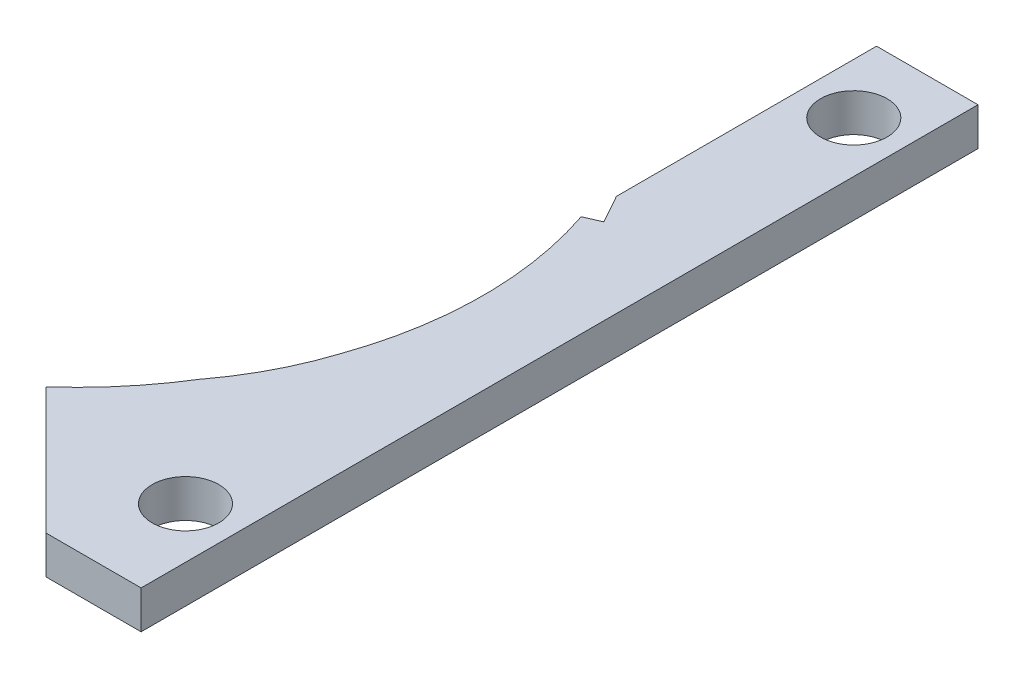
ISO-10303-21;
HEADER;
FILE_DESCRIPTION(('STEP AP214'),'2;1');
FILE_NAME('part.step','',(''),(''),'','','');
FILE_SCHEMA(('AUTOMOTIVE_DESIGN { 1 0 10303 214 1 1 1 1 }'));
ENDSEC;
DATA;
#1=APPLICATION_CONTEXT('core data for automotive mechanical design processes');
#2=APPLICATION_PROTOCOL_DEFINITION('international standard','automotive_design',2000,#1);
#3=PRODUCT_CONTEXT('',#1,'mechanical');
#4=PRODUCT('Part','Part','',(#3));
#5=PRODUCT_RELATED_PRODUCT_CATEGORY('part','',(#4));
#6=PRODUCT_DEFINITION_FORMATION('','',#4);
#7=PRODUCT_DEFINITION_CONTEXT('part definition',#1,'design');
#8=PRODUCT_DEFINITION('design','',#6,#7);
#9=PRODUCT_DEFINITION_SHAPE('','',#8);
#10=(LENGTH_UNIT() NAMED_UNIT(*) SI_UNIT(.MILLI.,.METRE.));
#11=(NAMED_UNIT(*) PLANE_ANGLE_UNIT() SI_UNIT($,.RADIAN.));
#12=(NAMED_UNIT(*) SI_UNIT($,.STERADIAN.) SOLID_ANGLE_UNIT());
#13=UNCERTAINTY_MEASURE_WITH_UNIT(LENGTH_MEASURE(1.E-05),#10,'distance_accuracy_value','');
#14=(GEOMETRIC_REPRESENTATION_CONTEXT(3) GLOBAL_UNCERTAINTY_ASSIGNED_CONTEXT((#13)) GLOBAL_UNIT_ASSIGNED_CONTEXT((#10,
#11,#12)) REPRESENTATION_CONTEXT('',''));
#15=CARTESIAN_POINT('',(0.,0.,0.));
#16=DIRECTION('',(0.,0.,1.));
#17=DIRECTION('',(1.,0.,0.));
#18=AXIS2_PLACEMENT_3D('',#15,#16,#17);
#19=CARTESIAN_POINT('',(647.682964532327,-6.,-147.088874281865));
#20=DIRECTION('',(0.,-1.,0.));
#21=DIRECTION('',(0.,0.,-1.));
#22=AXIS2_PLACEMENT_3D('',#19,#20,#21);
#23=PLANE('',#22);
#24=DIRECTION('',(0.707106781186552,0.,0.707106781186543));
#25=VECTOR('',#24,1.);
#26=CARTESIAN_POINT('',(695.499999999985,-6.,-84.3999999999907));
#27=LINE('',#26,#25);
#28=CARTESIAN_POINT('',(675.529768985971,-6.,-104.370231014004));
#29=VERTEX_POINT('',#28);
#30=CARTESIAN_POINT('',(695.499999999985,-6.,-84.3999999999907));
#31=VERTEX_POINT('',#30);
#32=EDGE_CURVE('E210',#29,#31,#27,.T.);
#33=ORIENTED_EDGE('',*,*,#32,.F.);
#34=CARTESIAN_POINT('',(635.500000000019,-6.,-149.399999999991));
#35=DIRECTION('',(0.,-1.,0.));
#36=DIRECTION('',(0.,0.,1.));
#37=AXIS2_PLACEMENT_3D('',#34,#35,#36);
#38=CIRCLE('',#37,60.25);
#39=CARTESIAN_POINT('',(686.799952909426,-6.,-117.80289045667));
#40=VERTEX_POINT('',#39);
#41=EDGE_CURVE('E223',#40,#29,#38,.T.);
#42=ORIENTED_EDGE('',*,*,#41,.F.);
#43=DIRECTION('',(-0.44034791738468,0.,-0.897827217038432));
#44=VECTOR('',#43,1.);
#45=CARTESIAN_POINT('',(697.045493522603,-6.,-96.9132146966131));
#46=LINE('',#45,#44);
#47=CARTESIAN_POINT('',(686.812759874788,-6.,-117.776778281238));
#48=VERTEX_POINT('',#47);
#49=EDGE_CURVE('E216',#48,#40,#46,.T.);
#50=ORIENTED_EDGE('',*,*,#49,.F.);
#51=CARTESIAN_POINT('',(647.682964532327,-6.,-147.088874281865));
#52=DIRECTION('',(0.,1.,0.));
#53=DIRECTION('',(0.,0.,-1.));
#54=AXIS2_PLACEMENT_3D('',#51,#52,#53);
#55=CIRCLE('',#54,48.8911020073474);
#56=CARTESIAN_POINT('',(694.236343401214,-6.,-132.151579634484));
#57=VERTEX_POINT('',#56);
#58=EDGE_CURVE('E47',#48,#57,#55,.T.);
#59=ORIENTED_EDGE('',*,*,#58,.T.);
#60=CARTESIAN_POINT('',(639.980034944456,-6.,-151.356607949702));
#61=DIRECTION('',(0.,1.,0.));
#62=DIRECTION('',(0.,0.,-1.));
#63=AXIS2_PLACEMENT_3D('',#60,#61,#62);
#64=CIRCLE('',#63,57.5550181994868);
#65=CARTESIAN_POINT('',(694.500002920536,-6.,-169.799850935426));
#66=VERTEX_POINT('',#65);
#67=EDGE_CURVE('E169',#57,#66,#64,.T.);
#68=ORIENTED_EDGE('',*,*,#67,.T.);
#69=DIRECTION('',(0.915294684403505,0.,-0.402784856595538));
#70=VECTOR('',#69,1.);
#71=CARTESIAN_POINT('',(694.500002920536,-6.,-169.799850935426));
#72=LINE('',#71,#70);
#73=CARTESIAN_POINT('',(696.999999798819,-6.,-170.900000320391));
#74=VERTEX_POINT('',#73);
#75=EDGE_CURVE('E189',#66,#74,#72,.T.);
#76=ORIENTED_EDGE('',*,*,#75,.T.);
#77=DIRECTION('',(-0.488075249911819,0.,-0.872801552716032));
#78=VECTOR('',#77,1.);
#79=CARTESIAN_POINT('',(696.999999798819,-6.,-170.900000320391));
#80=LINE('',#79,#78);
#81=CARTESIAN_POINT('',(694.500002920519,-6.,-175.370624793891));
#82=VERTEX_POINT('',#81);
#83=EDGE_CURVE('E188',#74,#82,#80,.T.);
#84=ORIENTED_EDGE('',*,*,#83,.T.);
#85=DIRECTION('',(0.,0.,-1.));
#86=VECTOR('',#85,1.);
#87=CARTESIAN_POINT('',(694.500002920519,-6.,-175.370624793891));
#88=LINE('',#87,#86);
#89=CARTESIAN_POINT('',(694.500002920519,-6.,-216.399998611891));
#90=VERTEX_POINT('',#89);
#91=EDGE_CURVE('E117',#82,#90,#88,.T.);
#92=ORIENTED_EDGE('',*,*,#91,.T.);
#93=DIRECTION('',(1.,0.,0.));
#94=VECTOR('',#93,1.);
#95=CARTESIAN_POINT('',(694.500002920519,-6.,-216.399998611891));
#96=LINE('',#95,#94);
#97=CARTESIAN_POINT('',(710.500000000019,-6.,-216.399998611891));
#98=VERTEX_POINT('',#97);
#99=EDGE_CURVE('E110',#90,#98,#96,.T.);
#100=ORIENTED_EDGE('',*,*,#99,.T.);
#101=DIRECTION('',(0.,0.,1.));
#102=VECTOR('',#101,1.);
#103=CARTESIAN_POINT('',(710.500000000019,-6.,-216.399998611891));
#104=LINE('',#103,#102);
#105=CARTESIAN_POINT('',(710.500000000019,-6.,-84.3999999999907));
#106=VERTEX_POINT('',#105);
#107=EDGE_CURVE('E114',#98,#106,#104,.T.);
#108=ORIENTED_EDGE('',*,*,#107,.T.);
#109=DIRECTION('',(-1.,0.,0.));
#110=VECTOR('',#109,1.);
#111=CARTESIAN_POINT('',(710.500000000019,-6.,-84.3999999999907));
#112=LINE('',#111,#110);
#113=EDGE_CURVE('E56',#106,#31,#112,.T.);
#114=ORIENTED_EDGE('',*,*,#113,.T.);
#115=EDGE_LOOP('',(#33,#42,#50,#59,#68,#76,#84,#92,#100,#108,#114));
#116=FACE_BOUND('',#115,.T.);
#117=CARTESIAN_POINT('',(702.500000000019,-6.,-204.808507537291));
#118=DIRECTION('',(0.,-1.,0.));
#119=DIRECTION('',(0.,0.,-1.));
#120=AXIS2_PLACEMENT_3D('',#117,#118,#119);
#121=CIRCLE('',#120,5.24999999999998);
#122=CARTESIAN_POINT('',(702.500000000019,-6.,-210.058507537291));
#123=VERTEX_POINT('',#122);
#124=EDGE_CURVE('E141',#123,#123,#121,.T.);
#125=ORIENTED_EDGE('',*,*,#124,.F.);
#126=EDGE_LOOP('',(#125));
#127=FACE_BOUND('',#126,.T.);
#128=CARTESIAN_POINT('',(702.500000000019,-6.,-99.3999999999907));
#129=DIRECTION('',(0.,-1.,0.));
#130=DIRECTION('',(0.,0.,-1.));
#131=AXIS2_PLACEMENT_3D('',#128,#129,#130);
#132=CIRCLE('',#131,5.24999999999998);
#133=CARTESIAN_POINT('',(702.500000000019,-6.,-104.649999999991));
#134=VERTEX_POINT('',#133);
#135=EDGE_CURVE('E198',#134,#134,#132,.T.);
#136=ORIENTED_EDGE('',*,*,#135,.F.);
#137=EDGE_LOOP('',(#136));
#138=FACE_BOUND('',#137,.T.);
#139=ADVANCED_FACE('F33',(#116,#127,#138),#23,.T.);
#140=CARTESIAN_POINT('',(647.682964532327,0.,-147.088874281865));
#141=DIRECTION('',(0.,-1.,0.));
#142=DIRECTION('',(0.,0.,-1.));
#143=AXIS2_PLACEMENT_3D('',#140,#141,#142);
#144=PLANE('',#143);
#145=CARTESIAN_POINT('',(635.500000000019,0.,-149.399999999991));
#146=DIRECTION('',(0.,-1.,0.));
#147=DIRECTION('',(0.,0.,1.));
#148=AXIS2_PLACEMENT_3D('',#145,#146,#147);
#149=CIRCLE('',#148,60.25);
#150=CARTESIAN_POINT('',(686.799952909426,0.,-117.80289045667));
#151=VERTEX_POINT('',#150);
#152=CARTESIAN_POINT('',(675.529768985971,0.,-104.370231014004));
#153=VERTEX_POINT('',#152);
#154=EDGE_CURVE('E217',#151,#153,#149,.T.);
#155=ORIENTED_EDGE('',*,*,#154,.T.);
#156=DIRECTION('',(0.707106781186552,0.,0.707106781186543));
#157=VECTOR('',#156,1.);
#158=CARTESIAN_POINT('',(695.499999999985,0.,-84.3999999999907));
#159=LINE('',#158,#157);
#160=CARTESIAN_POINT('',(695.499999999985,0.,-84.3999999999907));
#161=VERTEX_POINT('',#160);
#162=EDGE_CURVE('E213',#153,#161,#159,.T.);
#163=ORIENTED_EDGE('',*,*,#162,.T.);
#164=DIRECTION('',(-1.,0.,0.));
#165=VECTOR('',#164,1.);
#166=CARTESIAN_POINT('',(710.500000000019,0.,-84.3999999999907));
#167=LINE('',#166,#165);
#168=CARTESIAN_POINT('',(710.500000000019,0.,-84.3999999999907));
#169=VERTEX_POINT('',#168);
#170=EDGE_CURVE('E89',#169,#161,#167,.T.);
#171=ORIENTED_EDGE('',*,*,#170,.F.);
#172=DIRECTION('',(0.,0.,1.));
#173=VECTOR('',#172,1.);
#174=CARTESIAN_POINT('',(710.500000000019,0.,-216.399998611891));
#175=LINE('',#174,#173);
#176=CARTESIAN_POINT('',(710.500000000019,0.,-216.399998611891));
#177=VERTEX_POINT('',#176);
#178=EDGE_CURVE('E150',#177,#169,#175,.T.);
#179=ORIENTED_EDGE('',*,*,#178,.F.);
#180=DIRECTION('',(1.,0.,0.));
#181=VECTOR('',#180,1.);
#182=CARTESIAN_POINT('',(694.500002920519,0.,-216.399998611891));
#183=LINE('',#182,#181);
#184=CARTESIAN_POINT('',(694.500002920519,0.,-216.399998611891));
#185=VERTEX_POINT('',#184);
#186=EDGE_CURVE('E126',#185,#177,#183,.T.);
#187=ORIENTED_EDGE('',*,*,#186,.F.);
#188=DIRECTION('',(0.,0.,-1.));
#189=VECTOR('',#188,1.);
#190=CARTESIAN_POINT('',(694.500002920519,0.,-175.370624793891));
#191=LINE('',#190,#189);
#192=CARTESIAN_POINT('',(694.500002920519,0.,-175.370624793891));
#193=VERTEX_POINT('',#192);
#194=EDGE_CURVE('E147',#193,#185,#191,.T.);
#195=ORIENTED_EDGE('',*,*,#194,.F.);
#196=DIRECTION('',(-0.488075249911819,0.,-0.872801552716032));
#197=VECTOR('',#196,1.);
#198=CARTESIAN_POINT('',(696.999999798819,0.,-170.900000320391));
#199=LINE('',#198,#197);
#200=CARTESIAN_POINT('',(696.999999798819,0.,-170.900000320391));
#201=VERTEX_POINT('',#200);
#202=EDGE_CURVE('E145',#201,#193,#199,.T.);
#203=ORIENTED_EDGE('',*,*,#202,.F.);
#204=DIRECTION('',(0.915294684403505,0.,-0.402784856595538));
#205=VECTOR('',#204,1.);
#206=CARTESIAN_POINT('',(694.500002920536,0.,-169.799850935426));
#207=LINE('',#206,#205);
#208=CARTESIAN_POINT('',(694.500002920536,0.,-169.799850935426));
#209=VERTEX_POINT('',#208);
#210=EDGE_CURVE('E143',#209,#201,#207,.T.);
#211=ORIENTED_EDGE('',*,*,#210,.F.);
#212=CARTESIAN_POINT('',(639.980034944456,0.,-151.356607949702));
#213=DIRECTION('',(0.,1.,0.));
#214=DIRECTION('',(0.,0.,-1.));
#215=AXIS2_PLACEMENT_3D('',#212,#213,#214);
#216=CIRCLE('',#215,57.5550181994868);
#217=CARTESIAN_POINT('',(694.236343401214,0.,-132.151579634484));
#218=VERTEX_POINT('',#217);
#219=EDGE_CURVE('E140',#218,#209,#216,.T.);
#220=ORIENTED_EDGE('',*,*,#219,.F.);
#221=CARTESIAN_POINT('',(647.682964532327,0.,-147.088874281865));
#222=DIRECTION('',(0.,1.,0.));
#223=DIRECTION('',(0.,0.,-1.));
#224=AXIS2_PLACEMENT_3D('',#221,#222,#223);
#225=CIRCLE('',#224,48.8911020073474);
#226=CARTESIAN_POINT('',(686.812759874788,0.,-117.776778281238));
#227=VERTEX_POINT('',#226);
#228=EDGE_CURVE('E138',#227,#218,#225,.T.);
#229=ORIENTED_EDGE('',*,*,#228,.F.);
#230=DIRECTION('',(-0.44034791738468,0.,-0.897827217038432));
#231=VECTOR('',#230,1.);
#232=CARTESIAN_POINT('',(697.045493522603,0.,-96.9132146966131));
#233=LINE('',#232,#231);
#234=EDGE_CURVE('E219',#227,#151,#233,.T.);
#235=ORIENTED_EDGE('',*,*,#234,.T.);
#236=EDGE_LOOP('',(#155,#163,#171,#179,#187,#195,#203,#211,#220,#229,#235));
#237=FACE_BOUND('',#236,.T.);
#238=CARTESIAN_POINT('',(702.500000000019,0.,-204.808507537291));
#239=DIRECTION('',(0.,-1.,0.));
#240=DIRECTION('',(0.,0.,-1.));
#241=AXIS2_PLACEMENT_3D('',#238,#239,#240);
#242=CIRCLE('',#241,5.24999999999998);
#243=CARTESIAN_POINT('',(702.500000000019,0.,-210.058507537291));
#244=VERTEX_POINT('',#243);
#245=EDGE_CURVE('E195',#244,#244,#242,.T.);
#246=ORIENTED_EDGE('',*,*,#245,.T.);
#247=EDGE_LOOP('',(#246));
#248=FACE_BOUND('',#247,.T.);
#249=CARTESIAN_POINT('',(702.500000000019,0.,-99.3999999999907));
#250=DIRECTION('',(0.,-1.,0.));
#251=DIRECTION('',(0.,0.,-1.));
#252=AXIS2_PLACEMENT_3D('',#249,#250,#251);
#253=CIRCLE('',#252,5.24999999999998);
#254=CARTESIAN_POINT('',(702.500000000019,0.,-104.649999999991));
#255=VERTEX_POINT('',#254);
#256=EDGE_CURVE('E201',#255,#255,#253,.T.);
#257=ORIENTED_EDGE('',*,*,#256,.T.);
#258=EDGE_LOOP('',(#257));
#259=FACE_BOUND('',#258,.T.);
#260=ADVANCED_FACE('F176',(#237,#248,#259),#144,.F.);
#261=CARTESIAN_POINT('',(647.682964532327,-6.,-147.088874281865));
#262=DIRECTION('',(0.,1.,0.));
#263=DIRECTION('',(0.,0.,1.));
#264=AXIS2_PLACEMENT_3D('',#261,#262,#263);
#265=CYLINDRICAL_SURFACE('',#264,48.8911020073474);
#266=ORIENTED_EDGE('',*,*,#58,.F.);
#267=DIRECTION('',(0.,1.,0.));
#268=VECTOR('',#267,1.);
#269=CARTESIAN_POINT('',(686.812759874788,-6.,-117.776778281238));
#270=LINE('',#269,#268);
#271=EDGE_CURVE('E11',#48,#227,#270,.T.);
#272=ORIENTED_EDGE('',*,*,#271,.T.);
#273=ORIENTED_EDGE('',*,*,#228,.T.);
#274=DIRECTION('',(0.,1.,0.));
#275=VECTOR('',#274,1.);
#276=CARTESIAN_POINT('',(694.236343401214,-6.,-132.151579634484));
#277=LINE('',#276,#275);
#278=EDGE_CURVE('E41',#57,#218,#277,.T.);
#279=ORIENTED_EDGE('',*,*,#278,.F.);
#280=EDGE_LOOP('',(#266,#272,#273,#279));
#281=FACE_BOUND('',#280,.T.);
#282=ADVANCED_FACE('F35',(#281),#265,.F.);
#283=CARTESIAN_POINT('',(639.980034944456,-6.,-151.356607949702));
#284=DIRECTION('',(0.,1.,0.));
#285=DIRECTION('',(0.,0.,1.));
#286=AXIS2_PLACEMENT_3D('',#283,#284,#285);
#287=CYLINDRICAL_SURFACE('',#286,57.5550181994868);
#288=ORIENTED_EDGE('',*,*,#219,.T.);
#289=DIRECTION('',(0.,1.,0.));
#290=VECTOR('',#289,1.);
#291=CARTESIAN_POINT('',(694.500002920536,-6.,-169.799850935426));
#292=LINE('',#291,#290);
#293=EDGE_CURVE('E162',#66,#209,#292,.T.);
#294=ORIENTED_EDGE('',*,*,#293,.F.);
#295=ORIENTED_EDGE('',*,*,#67,.F.);
#296=ORIENTED_EDGE('',*,*,#278,.T.);
#297=EDGE_LOOP('',(#288,#294,#295,#296));
#298=FACE_BOUND('',#297,.T.);
#299=ADVANCED_FACE('F166',(#298),#287,.F.);
#300=CARTESIAN_POINT('',(694.500002920536,-6.,-169.799850935426));
#301=DIRECTION('',(0.402784856595538,0.,0.915294684403505));
#302=DIRECTION('',(0.915294684403505,0.,-0.402784856595538));
#303=AXIS2_PLACEMENT_3D('',#300,#301,#302);
#304=PLANE('',#303);
#305=ORIENTED_EDGE('',*,*,#210,.T.);
#306=DIRECTION('',(0.,1.,0.));
#307=VECTOR('',#306,1.);
#308=CARTESIAN_POINT('',(696.999999798819,-6.,-170.900000320391));
#309=LINE('',#308,#307);
#310=EDGE_CURVE('E159',#74,#201,#309,.T.);
#311=ORIENTED_EDGE('',*,*,#310,.F.);
#312=ORIENTED_EDGE('',*,*,#75,.F.);
#313=ORIENTED_EDGE('',*,*,#293,.T.);
#314=EDGE_LOOP('',(#305,#311,#312,#313));
#315=FACE_BOUND('',#314,.T.);
#316=ADVANCED_FACE('F182',(#315),#304,.F.);
#317=CARTESIAN_POINT('',(696.999999798819,-6.,-170.900000320391));
#318=DIRECTION('',(0.872801552716032,0.,-0.488075249911819));
#319=DIRECTION('',(-0.488075249911819,0.,-0.872801552716032));
#320=AXIS2_PLACEMENT_3D('',#317,#318,#319);
#321=PLANE('',#320);
#322=ORIENTED_EDGE('',*,*,#202,.T.);
#323=DIRECTION('',(0.,1.,0.));
#324=VECTOR('',#323,1.);
#325=CARTESIAN_POINT('',(694.500002920519,-6.,-175.370624793891));
#326=LINE('',#325,#324);
#327=EDGE_CURVE('E156',#82,#193,#326,.T.);
#328=ORIENTED_EDGE('',*,*,#327,.F.);
#329=ORIENTED_EDGE('',*,*,#83,.F.);
#330=ORIENTED_EDGE('',*,*,#310,.T.);
#331=EDGE_LOOP('',(#322,#328,#329,#330));
#332=FACE_BOUND('',#331,.T.);
#333=ADVANCED_FACE('F186',(#332),#321,.F.);
#334=CARTESIAN_POINT('',(694.500002920519,-6.,-175.370624793891));
#335=DIRECTION('',(1.,0.,0.));
#336=DIRECTION('',(0.,0.,-1.));
#337=AXIS2_PLACEMENT_3D('',#334,#335,#336);
#338=PLANE('',#337);
#339=ORIENTED_EDGE('',*,*,#194,.T.);
#340=DIRECTION('',(0.,1.,0.));
#341=VECTOR('',#340,1.);
#342=CARTESIAN_POINT('',(694.500002920519,-6.,-216.399998611891));
#343=LINE('',#342,#341);
#344=EDGE_CURVE('E129',#90,#185,#343,.T.);
#345=ORIENTED_EDGE('',*,*,#344,.F.);
#346=ORIENTED_EDGE('',*,*,#91,.F.);
#347=ORIENTED_EDGE('',*,*,#327,.T.);
#348=EDGE_LOOP('',(#339,#345,#346,#347));
#349=FACE_BOUND('',#348,.T.);
#350=ADVANCED_FACE('F329',(#349),#338,.F.);
#351=CARTESIAN_POINT('',(694.500002920519,-6.,-216.399998611891));
#352=DIRECTION('',(0.,0.,1.));
#353=DIRECTION('',(1.,0.,0.));
#354=AXIS2_PLACEMENT_3D('',#351,#352,#353);
#355=PLANE('',#354);
#356=ORIENTED_EDGE('',*,*,#186,.T.);
#357=DIRECTION('',(0.,1.,0.));
#358=VECTOR('',#357,1.);
#359=CARTESIAN_POINT('',(710.500000000019,-6.,-216.399998611891));
#360=LINE('',#359,#358);
#361=EDGE_CURVE('E123',#98,#177,#360,.T.);
#362=ORIENTED_EDGE('',*,*,#361,.F.);
#363=ORIENTED_EDGE('',*,*,#99,.F.);
#364=ORIENTED_EDGE('',*,*,#344,.T.);
#365=EDGE_LOOP('',(#356,#362,#363,#364));
#366=FACE_BOUND('',#365,.T.);
#367=ADVANCED_FACE('F124',(#366),#355,.F.);
#368=CARTESIAN_POINT('',(710.500000000019,-6.,-216.399998611891));
#369=DIRECTION('',(-1.,0.,0.));
#370=DIRECTION('',(0.,0.,1.));
#371=AXIS2_PLACEMENT_3D('',#368,#369,#370);
#372=PLANE('',#371);
#373=ORIENTED_EDGE('',*,*,#178,.T.);
#374=DIRECTION('',(0.,1.,0.));
#375=VECTOR('',#374,1.);
#376=CARTESIAN_POINT('',(710.500000000019,-6.,-84.3999999999907));
#377=LINE('',#376,#375);
#378=EDGE_CURVE('E130',#106,#169,#377,.T.);
#379=ORIENTED_EDGE('',*,*,#378,.F.);
#380=ORIENTED_EDGE('',*,*,#107,.F.);
#381=ORIENTED_EDGE('',*,*,#361,.T.);
#382=EDGE_LOOP('',(#373,#379,#380,#381));
#383=FACE_BOUND('',#382,.T.);
#384=ADVANCED_FACE('F132',(#383),#372,.F.);
#385=CARTESIAN_POINT('',(710.500000000019,-6.,-84.3999999999907));
#386=DIRECTION('',(0.,0.,-1.));
#387=DIRECTION('',(-1.,0.,0.));
#388=AXIS2_PLACEMENT_3D('',#385,#386,#387);
#389=PLANE('',#388);
#390=ORIENTED_EDGE('',*,*,#170,.T.);
#391=DIRECTION('',(0.,1.,0.));
#392=VECTOR('',#391,1.);
#393=CARTESIAN_POINT('',(695.499999999985,-6.,-84.3999999999907));
#394=LINE('',#393,#392);
#395=EDGE_CURVE('E134',#31,#161,#394,.T.);
#396=ORIENTED_EDGE('',*,*,#395,.F.);
#397=ORIENTED_EDGE('',*,*,#113,.F.);
#398=ORIENTED_EDGE('',*,*,#378,.T.);
#399=EDGE_LOOP('',(#390,#396,#397,#398));
#400=FACE_BOUND('',#399,.T.);
#401=ADVANCED_FACE('F245',(#400),#389,.F.);
#402=CARTESIAN_POINT('',(702.500000000019,-6.,-204.808507537291));
#403=DIRECTION('',(0.,1.,0.));
#404=DIRECTION('',(0.,0.,1.));
#405=AXIS2_PLACEMENT_3D('',#402,#403,#404);
#406=CYLINDRICAL_SURFACE('',#405,5.24999999999998);
#407=ORIENTED_EDGE('',*,*,#124,.T.);
#408=EDGE_LOOP('',(#407));
#409=FACE_BOUND('',#408,.T.);
#410=ORIENTED_EDGE('',*,*,#245,.F.);
#411=EDGE_LOOP('',(#410));
#412=FACE_BOUND('',#411,.T.);
#413=ADVANCED_FACE('F247',(#409,#412),#406,.F.);
#414=CARTESIAN_POINT('',(702.500000000019,-6.,-99.3999999999907));
#415=DIRECTION('',(0.,1.,0.));
#416=DIRECTION('',(0.,0.,1.));
#417=AXIS2_PLACEMENT_3D('',#414,#415,#416);
#418=CYLINDRICAL_SURFACE('',#417,5.24999999999998);
#419=ORIENTED_EDGE('',*,*,#135,.T.);
#420=EDGE_LOOP('',(#419));
#421=FACE_BOUND('',#420,.T.);
#422=ORIENTED_EDGE('',*,*,#256,.F.);
#423=EDGE_LOOP('',(#422));
#424=FACE_BOUND('',#423,.T.);
#425=ADVANCED_FACE('F253',(#421,#424),#418,.F.);
#426=CARTESIAN_POINT('',(695.499999999985,-6.,-84.3999999999907));
#427=DIRECTION('',(-0.707106781186543,0.,0.707106781186552));
#428=DIRECTION('',(0.707106781186552,0.,0.707106781186543));
#429=AXIS2_PLACEMENT_3D('',#426,#427,#428);
#430=PLANE('',#429);
#431=ORIENTED_EDGE('',*,*,#162,.F.);
#432=DIRECTION('',(0.,1.,0.));
#433=VECTOR('',#432,1.);
#434=CARTESIAN_POINT('',(675.529768985971,-6.,-104.370231014004));
#435=LINE('',#434,#433);
#436=EDGE_CURVE('E204',#29,#153,#435,.T.);
#437=ORIENTED_EDGE('',*,*,#436,.F.);
#438=ORIENTED_EDGE('',*,*,#32,.T.);
#439=ORIENTED_EDGE('',*,*,#395,.T.);
#440=EDGE_LOOP('',(#431,#437,#438,#439));
#441=FACE_BOUND('',#440,.T.);
#442=ADVANCED_FACE('F243',(#441),#430,.T.);
#443=CARTESIAN_POINT('',(697.045493522603,-6.,-96.9132146966131));
#444=DIRECTION('',(0.897827217038431,0.,-0.44034791738468));
#445=DIRECTION('',(-0.44034791738468,0.,-0.897827217038431));
#446=AXIS2_PLACEMENT_3D('',#443,#444,#445);
#447=PLANE('',#446);
#448=ORIENTED_EDGE('',*,*,#271,.F.);
#449=ORIENTED_EDGE('',*,*,#49,.T.);
#450=DIRECTION('',(0.,1.,0.));
#451=VECTOR('',#450,1.);
#452=CARTESIAN_POINT('',(686.799952909426,-6.,-117.80289045667));
#453=LINE('',#452,#451);
#454=EDGE_CURVE('E207',#40,#151,#453,.T.);
#455=ORIENTED_EDGE('',*,*,#454,.T.);
#456=ORIENTED_EDGE('',*,*,#234,.F.);
#457=EDGE_LOOP('',(#448,#449,#455,#456));
#458=FACE_BOUND('',#457,.T.);
#459=ADVANCED_FACE('F230',(#458),#447,.T.);
#460=CARTESIAN_POINT('',(635.500000000019,-6.,-149.399999999991));
#461=DIRECTION('',(0.,1.,0.));
#462=DIRECTION('',(0.,0.,1.));
#463=AXIS2_PLACEMENT_3D('',#460,#461,#462);
#464=CYLINDRICAL_SURFACE('',#463,60.25);
#465=ORIENTED_EDGE('',*,*,#41,.T.);
#466=ORIENTED_EDGE('',*,*,#436,.T.);
#467=ORIENTED_EDGE('',*,*,#154,.F.);
#468=ORIENTED_EDGE('',*,*,#454,.F.);
#469=EDGE_LOOP('',(#465,#466,#467,#468));
#470=FACE_BOUND('',#469,.T.);
#471=ADVANCED_FACE('F238',(#470),#464,.F.);
#472=CLOSED_SHELL('',(#139,#260,#282,#299,#316,#333,#350,#367,#384,#401,#413,#425,#442,#459,#471));
#473=MANIFOLD_SOLID_BREP('B2',#472);
#474=ADVANCED_BREP_SHAPE_REPRESENTATION('',(#18,#473),#14);
#475=SHAPE_DEFINITION_REPRESENTATION(#9,#474);
ENDSEC;
END-ISO-10303-21;
